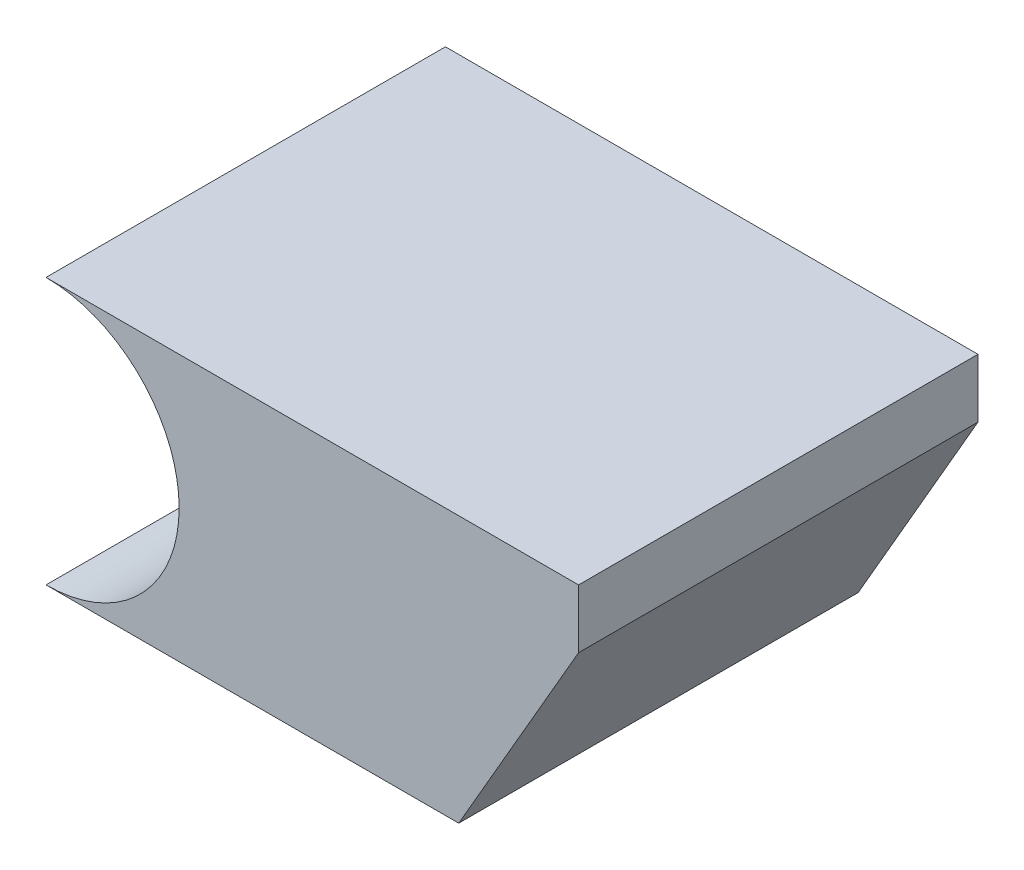
ISO-10303-21;
HEADER;
FILE_DESCRIPTION(('STEP AP214'),'2;1');
FILE_NAME('part.step','',(''),(''),'','','');
FILE_SCHEMA(('AUTOMOTIVE_DESIGN { 1 0 10303 214 1 1 1 1 }'));
ENDSEC;
DATA;
#1=APPLICATION_CONTEXT('core data for automotive mechanical design processes');
#2=APPLICATION_PROTOCOL_DEFINITION('international standard','automotive_design',2000,#1);
#3=PRODUCT_CONTEXT('',#1,'mechanical');
#4=PRODUCT('Part','Part','',(#3));
#5=PRODUCT_RELATED_PRODUCT_CATEGORY('part','',(#4));
#6=PRODUCT_DEFINITION_FORMATION('','',#4);
#7=PRODUCT_DEFINITION_CONTEXT('part definition',#1,'design');
#8=PRODUCT_DEFINITION('design','',#6,#7);
#9=PRODUCT_DEFINITION_SHAPE('','',#8);
#10=(LENGTH_UNIT() NAMED_UNIT(*) SI_UNIT(.MILLI.,.METRE.));
#11=(NAMED_UNIT(*) PLANE_ANGLE_UNIT() SI_UNIT($,.RADIAN.));
#12=(NAMED_UNIT(*) SI_UNIT($,.STERADIAN.) SOLID_ANGLE_UNIT());
#13=UNCERTAINTY_MEASURE_WITH_UNIT(LENGTH_MEASURE(1.E-05),#10,'distance_accuracy_value','');
#14=(GEOMETRIC_REPRESENTATION_CONTEXT(3) GLOBAL_UNCERTAINTY_ASSIGNED_CONTEXT((#13)) GLOBAL_UNIT_ASSIGNED_CONTEXT((#10,
#11,#12)) REPRESENTATION_CONTEXT('',''));
#15=CARTESIAN_POINT('',(0.,0.,0.));
#16=DIRECTION('',(0.,0.,1.));
#17=DIRECTION('',(1.,0.,0.));
#18=AXIS2_PLACEMENT_3D('',#15,#16,#17);
#19=CARTESIAN_POINT('',(0.,12.7,38.1));
#20=DIRECTION('',(0.,0.,-1.));
#21=DIRECTION('',(-1.,0.,0.));
#22=AXIS2_PLACEMENT_3D('',#19,#20,#21);
#23=CYLINDRICAL_SURFACE('',#22,12.7);
#24=CARTESIAN_POINT('',(0.,12.7,0.));
#25=DIRECTION('',(0.,0.,-1.));
#26=DIRECTION('',(1.,0.,0.));
#27=AXIS2_PLACEMENT_3D('',#24,#25,#26);
#28=CIRCLE('',#27,12.7);
#29=CARTESIAN_POINT('',(0.,25.4,0.));
#30=VERTEX_POINT('',#29);
#31=CARTESIAN_POINT('',(0.,0.,0.));
#32=VERTEX_POINT('',#31);
#33=EDGE_CURVE('E106',#30,#32,#28,.T.);
#34=ORIENTED_EDGE('',*,*,#33,.T.);
#35=DIRECTION('',(0.,0.,-1.));
#36=VECTOR('',#35,1.);
#37=CARTESIAN_POINT('',(0.,0.,38.1));
#38=LINE('',#37,#36);
#39=CARTESIAN_POINT('',(0.,0.,38.1));
#40=VERTEX_POINT('',#39);
#41=EDGE_CURVE('E89',#40,#32,#38,.T.);
#42=ORIENTED_EDGE('',*,*,#41,.F.);
#43=CARTESIAN_POINT('',(0.,12.7,38.1));
#44=DIRECTION('',(0.,0.,-1.));
#45=DIRECTION('',(1.,0.,0.));
#46=AXIS2_PLACEMENT_3D('',#43,#44,#45);
#47=CIRCLE('',#46,12.7);
#48=CARTESIAN_POINT('',(0.,25.4,38.1));
#49=VERTEX_POINT('',#48);
#50=EDGE_CURVE('E94',#49,#40,#47,.T.);
#51=ORIENTED_EDGE('',*,*,#50,.F.);
#52=DIRECTION('',(0.,0.,-1.));
#53=VECTOR('',#52,1.);
#54=CARTESIAN_POINT('',(0.,25.4,38.1));
#55=LINE('',#54,#53);
#56=EDGE_CURVE('E113',#49,#30,#55,.T.);
#57=ORIENTED_EDGE('',*,*,#56,.T.);
#58=EDGE_LOOP('',(#34,#42,#51,#57));
#59=FACE_BOUND('',#58,.T.);
#60=ADVANCED_FACE('F41',(#59),#23,.F.);
#61=CARTESIAN_POINT('',(0.,0.,38.1));
#62=DIRECTION('',(0.,1.,0.));
#63=DIRECTION('',(0.,0.,1.));
#64=AXIS2_PLACEMENT_3D('',#61,#62,#63);
#65=PLANE('',#64);
#66=DIRECTION('',(1.,0.,0.));
#67=VECTOR('',#66,1.);
#68=CARTESIAN_POINT('',(0.,0.,0.));
#69=LINE('',#68,#67);
#70=CARTESIAN_POINT('',(39.37,0.,0.));
#71=VERTEX_POINT('',#70);
#72=EDGE_CURVE('E121',#32,#71,#69,.T.);
#73=ORIENTED_EDGE('',*,*,#72,.T.);
#74=DIRECTION('',(0.,0.,1.));
#75=VECTOR('',#74,1.);
#76=CARTESIAN_POINT('',(39.37,0.,38.1));
#77=LINE('',#76,#75);
#78=CARTESIAN_POINT('',(39.37,0.,38.1));
#79=VERTEX_POINT('',#78);
#80=EDGE_CURVE('E50',#71,#79,#77,.T.);
#81=ORIENTED_EDGE('',*,*,#80,.T.);
#82=DIRECTION('',(1.,0.,0.));
#83=VECTOR('',#82,1.);
#84=CARTESIAN_POINT('',(0.,0.,38.1));
#85=LINE('',#84,#83);
#86=EDGE_CURVE('E85',#40,#79,#85,.T.);
#87=ORIENTED_EDGE('',*,*,#86,.F.);
#88=ORIENTED_EDGE('',*,*,#41,.T.);
#89=EDGE_LOOP('',(#73,#81,#87,#88));
#90=FACE_BOUND('',#89,.T.);
#91=ADVANCED_FACE('F87',(#90),#65,.F.);
#92=CARTESIAN_POINT('',(50.8,0.,38.1));
#93=DIRECTION('',(-1.,0.,0.));
#94=DIRECTION('',(0.,0.,1.));
#95=AXIS2_PLACEMENT_3D('',#92,#93,#94);
#96=PLANE('',#95);
#97=DIRECTION('',(0.,1.,0.));
#98=VECTOR('',#97,1.);
#99=CARTESIAN_POINT('',(50.8,0.,38.1));
#100=LINE('',#99,#98);
#101=CARTESIAN_POINT('',(50.8,19.7973407305122,38.1));
#102=VERTEX_POINT('',#101);
#103=CARTESIAN_POINT('',(50.8,25.4,38.1));
#104=VERTEX_POINT('',#103);
#105=EDGE_CURVE('E93',#102,#104,#100,.T.);
#106=ORIENTED_EDGE('',*,*,#105,.F.);
#107=DIRECTION('',(0.,0.,-1.));
#108=VECTOR('',#107,1.);
#109=CARTESIAN_POINT('',(50.8,19.7973407305122,38.1));
#110=LINE('',#109,#108);
#111=CARTESIAN_POINT('',(50.8,19.7973407305122,0.));
#112=VERTEX_POINT('',#111);
#113=EDGE_CURVE('E107',#102,#112,#110,.T.);
#114=ORIENTED_EDGE('',*,*,#113,.T.);
#115=DIRECTION('',(0.,1.,0.));
#116=VECTOR('',#115,1.);
#117=CARTESIAN_POINT('',(50.8,0.,0.));
#118=LINE('',#117,#116);
#119=CARTESIAN_POINT('',(50.8,25.4,0.));
#120=VERTEX_POINT('',#119);
#121=EDGE_CURVE('E119',#112,#120,#118,.T.);
#122=ORIENTED_EDGE('',*,*,#121,.T.);
#123=DIRECTION('',(0.,0.,-1.));
#124=VECTOR('',#123,1.);
#125=CARTESIAN_POINT('',(50.8,25.4,38.1));
#126=LINE('',#125,#124);
#127=EDGE_CURVE('E108',#104,#120,#126,.T.);
#128=ORIENTED_EDGE('',*,*,#127,.F.);
#129=EDGE_LOOP('',(#106,#114,#122,#128));
#130=FACE_BOUND('',#129,.T.);
#131=ADVANCED_FACE('F129',(#130),#96,.F.);
#132=CARTESIAN_POINT('',(0.,25.4,38.1));
#133=DIRECTION('',(0.,-1.,0.));
#134=DIRECTION('',(1.,0.,0.));
#135=AXIS2_PLACEMENT_3D('',#132,#133,#134);
#136=PLANE('',#135);
#137=DIRECTION('',(-1.,0.,0.));
#138=VECTOR('',#137,1.);
#139=CARTESIAN_POINT('',(0.,25.4,0.));
#140=LINE('',#139,#138);
#141=EDGE_CURVE('E103',#120,#30,#140,.T.);
#142=ORIENTED_EDGE('',*,*,#141,.T.);
#143=ORIENTED_EDGE('',*,*,#56,.F.);
#144=DIRECTION('',(-1.,0.,0.));
#145=VECTOR('',#144,1.);
#146=CARTESIAN_POINT('',(0.,25.4,38.1));
#147=LINE('',#146,#145);
#148=EDGE_CURVE('E99',#104,#49,#147,.T.);
#149=ORIENTED_EDGE('',*,*,#148,.F.);
#150=ORIENTED_EDGE('',*,*,#127,.T.);
#151=EDGE_LOOP('',(#142,#143,#149,#150));
#152=FACE_BOUND('',#151,.T.);
#153=ADVANCED_FACE('F132',(#152),#136,.F.);
#154=CARTESIAN_POINT('',(0.,12.7,38.1));
#155=DIRECTION('',(0.,0.,1.));
#156=DIRECTION('',(1.,0.,0.));
#157=AXIS2_PLACEMENT_3D('',#154,#155,#156);
#158=PLANE('',#157);
#159=ORIENTED_EDGE('',*,*,#86,.T.);
#160=DIRECTION('',(-0.500000000000002,-0.866025403784438,0.));
#161=VECTOR('',#160,1.);
#162=CARTESIAN_POINT('',(35.0267613140311,-7.52271007349672,38.1));
#163=LINE('',#162,#161);
#164=EDGE_CURVE('E11',#79,#102,#163,.F.);
#165=ORIENTED_EDGE('',*,*,#164,.T.);
#166=ORIENTED_EDGE('',*,*,#105,.T.);
#167=ORIENTED_EDGE('',*,*,#148,.T.);
#168=ORIENTED_EDGE('',*,*,#50,.T.);
#169=EDGE_LOOP('',(#159,#165,#166,#167,#168));
#170=FACE_BOUND('',#169,.T.);
#171=ADVANCED_FACE('F97',(#170),#158,.T.);
#172=CARTESIAN_POINT('',(0.,12.7,0.));
#173=DIRECTION('',(0.,0.,1.));
#174=DIRECTION('',(1.,0.,0.));
#175=AXIS2_PLACEMENT_3D('',#172,#173,#174);
#176=PLANE('',#175);
#177=ORIENTED_EDGE('',*,*,#121,.F.);
#178=DIRECTION('',(0.500000000000002,0.866025403784438,0.));
#179=VECTOR('',#178,1.);
#180=CARTESIAN_POINT('',(50.8,19.7973407305122,0.));
#181=LINE('',#180,#179);
#182=EDGE_CURVE('E64',#112,#71,#181,.F.);
#183=ORIENTED_EDGE('',*,*,#182,.T.);
#184=ORIENTED_EDGE('',*,*,#72,.F.);
#185=ORIENTED_EDGE('',*,*,#33,.F.);
#186=ORIENTED_EDGE('',*,*,#141,.F.);
#187=EDGE_LOOP('',(#177,#183,#184,#185,#186));
#188=FACE_BOUND('',#187,.T.);
#189=ADVANCED_FACE('F133',(#188),#176,.F.);
#190=CARTESIAN_POINT('',(50.8,19.7973407305122,38.1));
#191=DIRECTION('',(-0.866025403784438,0.500000000000002,0.));
#192=DIRECTION('',(0.,0.,-1.));
#193=AXIS2_PLACEMENT_3D('',#190,#191,#192);
#194=PLANE('',#193);
#195=ORIENTED_EDGE('',*,*,#164,.F.);
#196=ORIENTED_EDGE('',*,*,#80,.F.);
#197=ORIENTED_EDGE('',*,*,#182,.F.);
#198=ORIENTED_EDGE('',*,*,#113,.F.);
#199=EDGE_LOOP('',(#195,#196,#197,#198));
#200=FACE_BOUND('',#199,.T.);
#201=ADVANCED_FACE('F44',(#200),#194,.F.);
#202=CLOSED_SHELL('',(#60,#91,#131,#153,#171,#189,#201));
#203=MANIFOLD_SOLID_BREP('B2',#202);
#204=ADVANCED_BREP_SHAPE_REPRESENTATION('',(#18,#203),#14);
#205=SHAPE_DEFINITION_REPRESENTATION(#9,#204);
ENDSEC;
END-ISO-10303-21;
